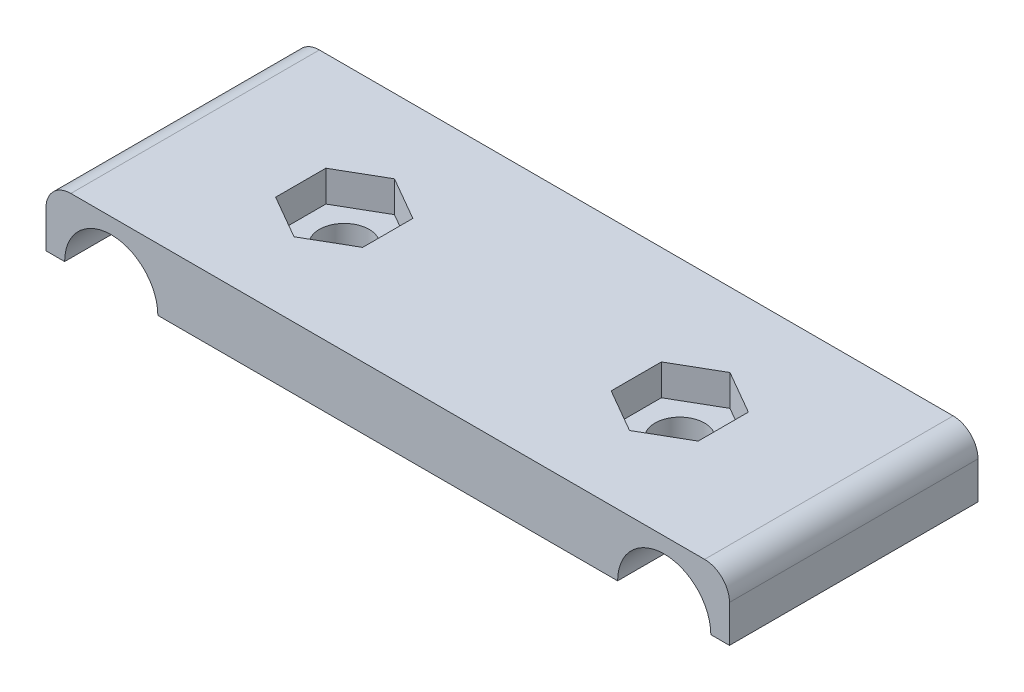
ISO-10303-21;
HEADER;
FILE_DESCRIPTION(('STEP AP214'),'2;1');
FILE_NAME('part.step','',(''),(''),'','','');
FILE_SCHEMA(('AUTOMOTIVE_DESIGN { 1 0 10303 214 1 1 1 1 }'));
ENDSEC;
DATA;
#1=APPLICATION_CONTEXT('core data for automotive mechanical design processes');
#2=APPLICATION_PROTOCOL_DEFINITION('international standard','automotive_design',2000,#1);
#3=PRODUCT_CONTEXT('',#1,'mechanical');
#4=PRODUCT('Part','Part','',(#3));
#5=PRODUCT_RELATED_PRODUCT_CATEGORY('part','',(#4));
#6=PRODUCT_DEFINITION_FORMATION('','',#4);
#7=PRODUCT_DEFINITION_CONTEXT('part definition',#1,'design');
#8=PRODUCT_DEFINITION('design','',#6,#7);
#9=PRODUCT_DEFINITION_SHAPE('','',#8);
#10=(LENGTH_UNIT() NAMED_UNIT(*) SI_UNIT(.MILLI.,.METRE.));
#11=(NAMED_UNIT(*) PLANE_ANGLE_UNIT() SI_UNIT($,.RADIAN.));
#12=(NAMED_UNIT(*) SI_UNIT($,.STERADIAN.) SOLID_ANGLE_UNIT());
#13=UNCERTAINTY_MEASURE_WITH_UNIT(LENGTH_MEASURE(1.E-05),#10,'distance_accuracy_value','');
#14=(GEOMETRIC_REPRESENTATION_CONTEXT(3) GLOBAL_UNCERTAINTY_ASSIGNED_CONTEXT((#13)) GLOBAL_UNIT_ASSIGNED_CONTEXT((#10,
#11,#12)) REPRESENTATION_CONTEXT('',''));
#15=CARTESIAN_POINT('',(0.,0.,0.));
#16=DIRECTION('',(0.,0.,1.));
#17=DIRECTION('',(1.,0.,0.));
#18=AXIS2_PLACEMENT_3D('',#15,#16,#17);
#19=CARTESIAN_POINT('',(-13.5,-2.5,10.));
#20=DIRECTION('',(0.,1.,0.));
#21=DIRECTION('',(0.,0.,1.));
#22=AXIS2_PLACEMENT_3D('',#19,#20,#21);
#23=CYLINDRICAL_SURFACE('',#22,2.);
#24=CARTESIAN_POINT('',(-13.5,-2.5,10.));
#25=DIRECTION('',(0.,1.,0.));
#26=DIRECTION('',(0.,0.,1.));
#27=AXIS2_PLACEMENT_3D('',#24,#25,#26);
#28=CIRCLE('',#27,2.);
#29=CARTESIAN_POINT('',(-13.5,-2.5,12.));
#30=VERTEX_POINT('',#29);
#31=EDGE_CURVE('E286',#30,#30,#28,.T.);
#32=ORIENTED_EDGE('',*,*,#31,.F.);
#33=EDGE_LOOP('',(#32));
#34=FACE_BOUND('',#33,.T.);
#35=CARTESIAN_POINT('',(-13.5,0.,10.));
#36=DIRECTION('',(0.,1.,0.));
#37=DIRECTION('',(0.,0.,1.));
#38=AXIS2_PLACEMENT_3D('',#35,#36,#37);
#39=CIRCLE('',#38,2.);
#40=CARTESIAN_POINT('',(-13.5,0.,12.));
#41=VERTEX_POINT('',#40);
#42=EDGE_CURVE('E37',#41,#41,#39,.F.);
#43=ORIENTED_EDGE('',*,*,#42,.F.);
#44=EDGE_LOOP('',(#43));
#45=FACE_BOUND('',#44,.T.);
#46=ADVANCED_FACE('F33',(#34,#45),#23,.F.);
#47=CARTESIAN_POINT('',(13.5,-2.5,10.));
#48=DIRECTION('',(0.,1.,0.));
#49=DIRECTION('',(0.,0.,1.));
#50=AXIS2_PLACEMENT_3D('',#47,#48,#49);
#51=CYLINDRICAL_SURFACE('',#50,2.);
#52=CARTESIAN_POINT('',(13.5,-2.5,10.));
#53=DIRECTION('',(0.,1.,0.));
#54=DIRECTION('',(0.,0.,1.));
#55=AXIS2_PLACEMENT_3D('',#52,#53,#54);
#56=CIRCLE('',#55,2.);
#57=CARTESIAN_POINT('',(13.5,-2.5,12.));
#58=VERTEX_POINT('',#57);
#59=EDGE_CURVE('E289',#58,#58,#56,.T.);
#60=ORIENTED_EDGE('',*,*,#59,.F.);
#61=EDGE_LOOP('',(#60));
#62=FACE_BOUND('',#61,.T.);
#63=CARTESIAN_POINT('',(13.5,0.,10.));
#64=DIRECTION('',(0.,1.,0.));
#65=DIRECTION('',(0.,0.,1.));
#66=AXIS2_PLACEMENT_3D('',#63,#64,#65);
#67=CIRCLE('',#66,2.);
#68=CARTESIAN_POINT('',(13.5,0.,12.));
#69=VERTEX_POINT('',#68);
#70=EDGE_CURVE('E276',#69,#69,#67,.F.);
#71=ORIENTED_EDGE('',*,*,#70,.F.);
#72=EDGE_LOOP('',(#71));
#73=FACE_BOUND('',#72,.T.);
#74=ADVANCED_FACE('F364',(#62,#73),#51,.F.);
#75=CARTESIAN_POINT('',(-27.5,2.5,20.));
#76=DIRECTION('',(1.,0.,0.));
#77=DIRECTION('',(0.,0.,-1.));
#78=AXIS2_PLACEMENT_3D('',#75,#76,#77);
#79=PLANE('',#78);
#80=DIRECTION('',(0.,-1.,0.));
#81=VECTOR('',#80,1.);
#82=CARTESIAN_POINT('',(-27.5,2.5,20.));
#83=LINE('',#82,#81);
#84=CARTESIAN_POINT('',(-27.5,0.499999999999998,20.));
#85=VERTEX_POINT('',#84);
#86=CARTESIAN_POINT('',(-27.5,-2.5,20.));
#87=VERTEX_POINT('',#86);
#88=EDGE_CURVE('E293',#85,#87,#83,.T.);
#89=ORIENTED_EDGE('',*,*,#88,.F.);
#90=DIRECTION('',(0.,0.,-1.));
#91=VECTOR('',#90,1.);
#92=CARTESIAN_POINT('',(-27.5,0.499999999999998,20.));
#93=LINE('',#92,#91);
#94=CARTESIAN_POINT('',(-27.5,0.499999999999998,0.));
#95=VERTEX_POINT('',#94);
#96=EDGE_CURVE('E11',#85,#95,#93,.T.);
#97=ORIENTED_EDGE('',*,*,#96,.T.);
#98=DIRECTION('',(0.,-1.,0.));
#99=VECTOR('',#98,1.);
#100=CARTESIAN_POINT('',(-27.5,2.5,0.));
#101=LINE('',#100,#99);
#102=CARTESIAN_POINT('',(-27.5,-2.5,0.));
#103=VERTEX_POINT('',#102);
#104=EDGE_CURVE('E292',#95,#103,#101,.T.);
#105=ORIENTED_EDGE('',*,*,#104,.T.);
#106=DIRECTION('',(0.,0.,-1.));
#107=VECTOR('',#106,1.);
#108=CARTESIAN_POINT('',(-27.5,-2.5,20.));
#109=LINE('',#108,#107);
#110=EDGE_CURVE('E343',#87,#103,#109,.T.);
#111=ORIENTED_EDGE('',*,*,#110,.F.);
#112=EDGE_LOOP('',(#89,#97,#105,#111));
#113=FACE_BOUND('',#112,.T.);
#114=ADVANCED_FACE('F366',(#113),#79,.F.);
#115=CARTESIAN_POINT('',(-27.5,-2.5,20.));
#116=DIRECTION('',(0.,1.,0.));
#117=DIRECTION('',(0.,0.,1.));
#118=AXIS2_PLACEMENT_3D('',#115,#116,#117);
#119=PLANE('',#118);
#120=DIRECTION('',(1.,0.,0.));
#121=VECTOR('',#120,1.);
#122=CARTESIAN_POINT('',(-27.5,-2.5,0.));
#123=LINE('',#122,#121);
#124=CARTESIAN_POINT('',(-26.,-2.5,0.));
#125=VERTEX_POINT('',#124);
#126=EDGE_CURVE('E314',#103,#125,#123,.T.);
#127=ORIENTED_EDGE('',*,*,#126,.T.);
#128=DIRECTION('',(0.,0.,-1.));
#129=VECTOR('',#128,1.);
#130=CARTESIAN_POINT('',(-26.,-2.5,20.));
#131=LINE('',#130,#129);
#132=CARTESIAN_POINT('',(-26.,-2.5,20.));
#133=VERTEX_POINT('',#132);
#134=EDGE_CURVE('E340',#133,#125,#131,.T.);
#135=ORIENTED_EDGE('',*,*,#134,.F.);
#136=DIRECTION('',(1.,0.,0.));
#137=VECTOR('',#136,1.);
#138=CARTESIAN_POINT('',(-27.5,-2.5,20.));
#139=LINE('',#138,#137);
#140=EDGE_CURVE('E295',#87,#133,#139,.T.);
#141=ORIENTED_EDGE('',*,*,#140,.F.);
#142=ORIENTED_EDGE('',*,*,#110,.T.);
#143=EDGE_LOOP('',(#127,#135,#141,#142));
#144=FACE_BOUND('',#143,.T.);
#145=ADVANCED_FACE('F373',(#144),#119,.F.);
#146=CARTESIAN_POINT('',(-22.25,-2.5,20.));
#147=DIRECTION('',(0.,0.,-1.));
#148=DIRECTION('',(-1.,0.,0.));
#149=AXIS2_PLACEMENT_3D('',#146,#147,#148);
#150=CYLINDRICAL_SURFACE('',#149,3.75);
#151=CARTESIAN_POINT('',(-22.25,-2.5,0.));
#152=DIRECTION('',(0.,0.,-1.));
#153=DIRECTION('',(1.,0.,0.));
#154=AXIS2_PLACEMENT_3D('',#151,#152,#153);
#155=CIRCLE('',#154,3.75);
#156=CARTESIAN_POINT('',(-18.5,-2.5,0.));
#157=VERTEX_POINT('',#156);
#158=EDGE_CURVE('E316',#125,#157,#155,.T.);
#159=ORIENTED_EDGE('',*,*,#158,.T.);
#160=DIRECTION('',(0.,0.,-1.));
#161=VECTOR('',#160,1.);
#162=CARTESIAN_POINT('',(-18.5,-2.5,20.));
#163=LINE('',#162,#161);
#164=CARTESIAN_POINT('',(-18.5,-2.5,20.));
#165=VERTEX_POINT('',#164);
#166=EDGE_CURVE('E337',#165,#157,#163,.T.);
#167=ORIENTED_EDGE('',*,*,#166,.F.);
#168=CARTESIAN_POINT('',(-22.25,-2.5,20.));
#169=DIRECTION('',(0.,0.,-1.));
#170=DIRECTION('',(1.,0.,0.));
#171=AXIS2_PLACEMENT_3D('',#168,#169,#170);
#172=CIRCLE('',#171,3.75);
#173=EDGE_CURVE('E298',#133,#165,#172,.T.);
#174=ORIENTED_EDGE('',*,*,#173,.F.);
#175=ORIENTED_EDGE('',*,*,#134,.T.);
#176=EDGE_LOOP('',(#159,#167,#174,#175));
#177=FACE_BOUND('',#176,.T.);
#178=ADVANCED_FACE('F409',(#177),#150,.F.);
#179=CARTESIAN_POINT('',(-18.5,-2.5,20.));
#180=DIRECTION('',(0.,1.,0.));
#181=DIRECTION('',(-1.,0.,0.));
#182=AXIS2_PLACEMENT_3D('',#179,#180,#181);
#183=PLANE('',#182);
#184=ORIENTED_EDGE('',*,*,#31,.T.);
#185=EDGE_LOOP('',(#184));
#186=FACE_BOUND('',#185,.T.);
#187=ORIENTED_EDGE('',*,*,#59,.T.);
#188=EDGE_LOOP('',(#187));
#189=FACE_BOUND('',#188,.T.);
#190=DIRECTION('',(1.,0.,0.));
#191=VECTOR('',#190,1.);
#192=CARTESIAN_POINT('',(-18.5,-2.5,0.));
#193=LINE('',#192,#191);
#194=CARTESIAN_POINT('',(18.5,-2.5,0.));
#195=VERTEX_POINT('',#194);
#196=EDGE_CURVE('E318',#157,#195,#193,.T.);
#197=ORIENTED_EDGE('',*,*,#196,.T.);
#198=DIRECTION('',(0.,0.,-1.));
#199=VECTOR('',#198,1.);
#200=CARTESIAN_POINT('',(18.5,-2.5,20.));
#201=LINE('',#200,#199);
#202=CARTESIAN_POINT('',(18.5,-2.5,20.));
#203=VERTEX_POINT('',#202);
#204=EDGE_CURVE('E334',#203,#195,#201,.T.);
#205=ORIENTED_EDGE('',*,*,#204,.F.);
#206=DIRECTION('',(1.,0.,0.));
#207=VECTOR('',#206,1.);
#208=CARTESIAN_POINT('',(-18.5,-2.5,20.));
#209=LINE('',#208,#207);
#210=EDGE_CURVE('E300',#165,#203,#209,.T.);
#211=ORIENTED_EDGE('',*,*,#210,.F.);
#212=ORIENTED_EDGE('',*,*,#166,.T.);
#213=EDGE_LOOP('',(#197,#205,#211,#212));
#214=FACE_BOUND('',#213,.T.);
#215=ADVANCED_FACE('F405',(#186,#189,#214),#183,.F.);
#216=CARTESIAN_POINT('',(22.25,-2.5,20.));
#217=DIRECTION('',(0.,0.,-1.));
#218=DIRECTION('',(-1.,0.,0.));
#219=AXIS2_PLACEMENT_3D('',#216,#217,#218);
#220=CYLINDRICAL_SURFACE('',#219,3.75);
#221=CARTESIAN_POINT('',(22.25,-2.5,0.));
#222=DIRECTION('',(0.,0.,-1.));
#223=DIRECTION('',(1.,0.,0.));
#224=AXIS2_PLACEMENT_3D('',#221,#222,#223);
#225=CIRCLE('',#224,3.75);
#226=CARTESIAN_POINT('',(26.,-2.5,0.));
#227=VERTEX_POINT('',#226);
#228=EDGE_CURVE('E320',#195,#227,#225,.T.);
#229=ORIENTED_EDGE('',*,*,#228,.T.);
#230=DIRECTION('',(0.,0.,-1.));
#231=VECTOR('',#230,1.);
#232=CARTESIAN_POINT('',(26.,-2.5,20.));
#233=LINE('',#232,#231);
#234=CARTESIAN_POINT('',(26.,-2.5,20.));
#235=VERTEX_POINT('',#234);
#236=EDGE_CURVE('E331',#235,#227,#233,.T.);
#237=ORIENTED_EDGE('',*,*,#236,.F.);
#238=CARTESIAN_POINT('',(22.25,-2.5,20.));
#239=DIRECTION('',(0.,0.,-1.));
#240=DIRECTION('',(1.,0.,0.));
#241=AXIS2_PLACEMENT_3D('',#238,#239,#240);
#242=CIRCLE('',#241,3.75);
#243=EDGE_CURVE('E302',#203,#235,#242,.T.);
#244=ORIENTED_EDGE('',*,*,#243,.F.);
#245=ORIENTED_EDGE('',*,*,#204,.T.);
#246=EDGE_LOOP('',(#229,#237,#244,#245));
#247=FACE_BOUND('',#246,.T.);
#248=ADVANCED_FACE('F401',(#247),#220,.F.);
#249=CARTESIAN_POINT('',(26.,-2.5,20.));
#250=DIRECTION('',(0.,1.,0.));
#251=DIRECTION('',(-1.,0.,0.));
#252=AXIS2_PLACEMENT_3D('',#249,#250,#251);
#253=PLANE('',#252);
#254=DIRECTION('',(1.,0.,0.));
#255=VECTOR('',#254,1.);
#256=CARTESIAN_POINT('',(26.,-2.5,0.));
#257=LINE('',#256,#255);
#258=CARTESIAN_POINT('',(27.5,-2.5,0.));
#259=VERTEX_POINT('',#258);
#260=EDGE_CURVE('E322',#227,#259,#257,.T.);
#261=ORIENTED_EDGE('',*,*,#260,.T.);
#262=DIRECTION('',(0.,0.,-1.));
#263=VECTOR('',#262,1.);
#264=CARTESIAN_POINT('',(27.5,-2.5,20.));
#265=LINE('',#264,#263);
#266=CARTESIAN_POINT('',(27.5,-2.5,20.));
#267=VERTEX_POINT('',#266);
#268=EDGE_CURVE('E312',#267,#259,#265,.T.);
#269=ORIENTED_EDGE('',*,*,#268,.F.);
#270=DIRECTION('',(1.,0.,0.));
#271=VECTOR('',#270,1.);
#272=CARTESIAN_POINT('',(26.,-2.5,20.));
#273=LINE('',#272,#271);
#274=EDGE_CURVE('E304',#235,#267,#273,.T.);
#275=ORIENTED_EDGE('',*,*,#274,.F.);
#276=ORIENTED_EDGE('',*,*,#236,.T.);
#277=EDGE_LOOP('',(#261,#269,#275,#276));
#278=FACE_BOUND('',#277,.T.);
#279=ADVANCED_FACE('F397',(#278),#253,.F.);
#280=CARTESIAN_POINT('',(27.5,2.5,20.));
#281=DIRECTION('',(-1.,0.,0.));
#282=DIRECTION('',(0.,0.,1.));
#283=AXIS2_PLACEMENT_3D('',#280,#281,#282);
#284=PLANE('',#283);
#285=DIRECTION('',(0.,1.,0.));
#286=VECTOR('',#285,1.);
#287=CARTESIAN_POINT('',(27.5,2.5,0.));
#288=LINE('',#287,#286);
#289=CARTESIAN_POINT('',(27.5,0.499999999999998,0.));
#290=VERTEX_POINT('',#289);
#291=EDGE_CURVE('E324',#259,#290,#288,.T.);
#292=ORIENTED_EDGE('',*,*,#291,.T.);
#293=DIRECTION('',(0.,0.,-1.));
#294=VECTOR('',#293,1.);
#295=CARTESIAN_POINT('',(27.5,0.499999999999998,20.));
#296=LINE('',#295,#294);
#297=CARTESIAN_POINT('',(27.5,0.499999999999998,20.));
#298=VERTEX_POINT('',#297);
#299=EDGE_CURVE('E355',#290,#298,#296,.F.);
#300=ORIENTED_EDGE('',*,*,#299,.T.);
#301=DIRECTION('',(0.,1.,0.));
#302=VECTOR('',#301,1.);
#303=CARTESIAN_POINT('',(27.5,2.5,20.));
#304=LINE('',#303,#302);
#305=EDGE_CURVE('E306',#267,#298,#304,.T.);
#306=ORIENTED_EDGE('',*,*,#305,.F.);
#307=ORIENTED_EDGE('',*,*,#268,.T.);
#308=EDGE_LOOP('',(#292,#300,#306,#307));
#309=FACE_BOUND('',#308,.T.);
#310=ADVANCED_FACE('F393',(#309),#284,.F.);
#311=CARTESIAN_POINT('',(-27.5,2.5,20.));
#312=DIRECTION('',(0.,-1.,0.));
#313=DIRECTION('',(0.,0.,-1.));
#314=AXIS2_PLACEMENT_3D('',#311,#312,#313);
#315=PLANE('',#314);
#316=DIRECTION('',(-0.866025403784439,0.,0.5));
#317=VECTOR('',#316,1.);
#318=CARTESIAN_POINT('',(-13.5,2.5,5.95854811567262));
#319=LINE('',#318,#317);
#320=CARTESIAN_POINT('',(-13.5,2.5,5.95854811567262));
#321=VERTEX_POINT('',#320);
#322=CARTESIAN_POINT('',(-17.,2.5,7.97927405783631));
#323=VERTEX_POINT('',#322);
#324=EDGE_CURVE('E220',#321,#323,#319,.T.);
#325=ORIENTED_EDGE('',*,*,#324,.F.);
#326=DIRECTION('',(-0.866025403784439,0.,-0.5));
#327=VECTOR('',#326,1.);
#328=CARTESIAN_POINT('',(-10.,2.5,7.97927405783631));
#329=LINE('',#328,#327);
#330=CARTESIAN_POINT('',(-10.,2.5,7.97927405783631));
#331=VERTEX_POINT('',#330);
#332=EDGE_CURVE('E50',#331,#321,#329,.T.);
#333=ORIENTED_EDGE('',*,*,#332,.F.);
#334=DIRECTION('',(0.,0.,-1.));
#335=VECTOR('',#334,1.);
#336=CARTESIAN_POINT('',(-10.,2.5,12.0207259421637));
#337=LINE('',#336,#335);
#338=CARTESIAN_POINT('',(-10.,2.5,12.0207259421637));
#339=VERTEX_POINT('',#338);
#340=EDGE_CURVE('E206',#339,#331,#337,.T.);
#341=ORIENTED_EDGE('',*,*,#340,.F.);
#342=DIRECTION('',(0.866025403784439,0.,-0.5));
#343=VECTOR('',#342,1.);
#344=CARTESIAN_POINT('',(-13.5,2.5,14.0414518843274));
#345=LINE('',#344,#343);
#346=CARTESIAN_POINT('',(-13.5,2.5,14.0414518843274));
#347=VERTEX_POINT('',#346);
#348=EDGE_CURVE('E209',#347,#339,#345,.T.);
#349=ORIENTED_EDGE('',*,*,#348,.F.);
#350=DIRECTION('',(0.866025403784438,0.,0.5));
#351=VECTOR('',#350,1.);
#352=CARTESIAN_POINT('',(-17.,2.5,12.0207259421637));
#353=LINE('',#352,#351);
#354=CARTESIAN_POINT('',(-17.,2.5,12.0207259421637));
#355=VERTEX_POINT('',#354);
#356=EDGE_CURVE('E225',#355,#347,#353,.T.);
#357=ORIENTED_EDGE('',*,*,#356,.F.);
#358=DIRECTION('',(0.,0.,1.));
#359=VECTOR('',#358,1.);
#360=CARTESIAN_POINT('',(-17.,2.5,7.97927405783631));
#361=LINE('',#360,#359);
#362=EDGE_CURVE('E222',#323,#355,#361,.T.);
#363=ORIENTED_EDGE('',*,*,#362,.F.);
#364=EDGE_LOOP('',(#325,#333,#341,#349,#357,#363));
#365=FACE_BOUND('',#364,.T.);
#366=DIRECTION('',(-0.866025403784438,0.,0.5));
#367=VECTOR('',#366,1.);
#368=CARTESIAN_POINT('',(13.5,2.5,5.95854811567262));
#369=LINE('',#368,#367);
#370=CARTESIAN_POINT('',(13.5,2.5,5.95854811567263));
#371=VERTEX_POINT('',#370);
#372=CARTESIAN_POINT('',(10.,2.5,7.97927405783631));
#373=VERTEX_POINT('',#372);
#374=EDGE_CURVE('E260',#371,#373,#369,.T.);
#375=ORIENTED_EDGE('',*,*,#374,.F.);
#376=DIRECTION('',(-0.866025403784439,0.,-0.5));
#377=VECTOR('',#376,1.);
#378=CARTESIAN_POINT('',(17.,2.5,7.97927405783631));
#379=LINE('',#378,#377);
#380=CARTESIAN_POINT('',(17.,2.5,7.97927405783631));
#381=VERTEX_POINT('',#380);
#382=EDGE_CURVE('E58',#381,#371,#379,.T.);
#383=ORIENTED_EDGE('',*,*,#382,.F.);
#384=DIRECTION('',(0.,0.,-1.));
#385=VECTOR('',#384,1.);
#386=CARTESIAN_POINT('',(17.,2.5,12.0207259421637));
#387=LINE('',#386,#385);
#388=CARTESIAN_POINT('',(17.,2.5,12.0207259421637));
#389=VERTEX_POINT('',#388);
#390=EDGE_CURVE('E243',#389,#381,#387,.T.);
#391=ORIENTED_EDGE('',*,*,#390,.F.);
#392=DIRECTION('',(0.866025403784438,0.,-0.5));
#393=VECTOR('',#392,1.);
#394=CARTESIAN_POINT('',(13.5,2.5,14.0414518843274));
#395=LINE('',#394,#393);
#396=CARTESIAN_POINT('',(13.5,2.5,14.0414518843274));
#397=VERTEX_POINT('',#396);
#398=EDGE_CURVE('E269',#397,#389,#395,.T.);
#399=ORIENTED_EDGE('',*,*,#398,.F.);
#400=DIRECTION('',(0.866025403784439,0.,0.5));
#401=VECTOR('',#400,1.);
#402=CARTESIAN_POINT('',(10.,2.5,12.0207259421637));
#403=LINE('',#402,#401);
#404=CARTESIAN_POINT('',(10.,2.5,12.0207259421637));
#405=VERTEX_POINT('',#404);
#406=EDGE_CURVE('E266',#405,#397,#403,.T.);
#407=ORIENTED_EDGE('',*,*,#406,.F.);
#408=DIRECTION('',(0.,0.,1.));
#409=VECTOR('',#408,1.);
#410=CARTESIAN_POINT('',(10.,2.5,7.97927405783631));
#411=LINE('',#410,#409);
#412=EDGE_CURVE('E263',#373,#405,#411,.T.);
#413=ORIENTED_EDGE('',*,*,#412,.F.);
#414=EDGE_LOOP('',(#375,#383,#391,#399,#407,#413));
#415=FACE_BOUND('',#414,.T.);
#416=DIRECTION('',(-1.,0.,0.));
#417=VECTOR('',#416,1.);
#418=CARTESIAN_POINT('',(-27.5,2.5,20.));
#419=LINE('',#418,#417);
#420=CARTESIAN_POINT('',(25.5,2.5,20.));
#421=VERTEX_POINT('',#420);
#422=CARTESIAN_POINT('',(-25.5,2.5,20.));
#423=VERTEX_POINT('',#422);
#424=EDGE_CURVE('E309',#421,#423,#419,.T.);
#425=ORIENTED_EDGE('',*,*,#424,.F.);
#426=DIRECTION('',(0.,0.,-1.));
#427=VECTOR('',#426,1.);
#428=CARTESIAN_POINT('',(25.5,2.5,20.));
#429=LINE('',#428,#427);
#430=CARTESIAN_POINT('',(25.5,2.5,0.));
#431=VERTEX_POINT('',#430);
#432=EDGE_CURVE('E348',#421,#431,#429,.T.);
#433=ORIENTED_EDGE('',*,*,#432,.T.);
#434=DIRECTION('',(-1.,0.,0.));
#435=VECTOR('',#434,1.);
#436=CARTESIAN_POINT('',(-27.5,2.5,0.));
#437=LINE('',#436,#435);
#438=CARTESIAN_POINT('',(-25.5,2.5,0.));
#439=VERTEX_POINT('',#438);
#440=EDGE_CURVE('E296',#431,#439,#437,.T.);
#441=ORIENTED_EDGE('',*,*,#440,.T.);
#442=DIRECTION('',(0.,0.,-1.));
#443=VECTOR('',#442,1.);
#444=CARTESIAN_POINT('',(-25.5,2.5,20.));
#445=LINE('',#444,#443);
#446=EDGE_CURVE('E346',#439,#423,#445,.F.);
#447=ORIENTED_EDGE('',*,*,#446,.T.);
#448=EDGE_LOOP('',(#425,#433,#441,#447));
#449=FACE_BOUND('',#448,.T.);
#450=ADVANCED_FACE('F385',(#365,#415,#449),#315,.F.);
#451=CARTESIAN_POINT('',(-22.25,-2.5,20.));
#452=DIRECTION('',(0.,0.,1.));
#453=DIRECTION('',(1.,0.,0.));
#454=AXIS2_PLACEMENT_3D('',#451,#452,#453);
#455=PLANE('',#454);
#456=ORIENTED_EDGE('',*,*,#305,.T.);
#457=CARTESIAN_POINT('',(25.5,0.499999999999998,20.));
#458=DIRECTION('',(0.,0.,1.));
#459=DIRECTION('',(1.,0.,0.));
#460=AXIS2_PLACEMENT_3D('',#457,#458,#459);
#461=CIRCLE('',#460,2.);
#462=EDGE_CURVE('E42',#298,#421,#461,.T.);
#463=ORIENTED_EDGE('',*,*,#462,.T.);
#464=ORIENTED_EDGE('',*,*,#424,.T.);
#465=CARTESIAN_POINT('',(-25.5,0.499999999999998,20.));
#466=DIRECTION('',(0.,0.,1.));
#467=DIRECTION('',(1.,0.,0.));
#468=AXIS2_PLACEMENT_3D('',#465,#466,#467);
#469=CIRCLE('',#468,2.);
#470=EDGE_CURVE('E357',#423,#85,#469,.T.);
#471=ORIENTED_EDGE('',*,*,#470,.T.);
#472=ORIENTED_EDGE('',*,*,#88,.T.);
#473=ORIENTED_EDGE('',*,*,#140,.T.);
#474=ORIENTED_EDGE('',*,*,#173,.T.);
#475=ORIENTED_EDGE('',*,*,#210,.T.);
#476=ORIENTED_EDGE('',*,*,#243,.T.);
#477=ORIENTED_EDGE('',*,*,#274,.T.);
#478=EDGE_LOOP('',(#456,#463,#464,#471,#472,#473,#474,#475,#476,#477));
#479=FACE_BOUND('',#478,.T.);
#480=ADVANCED_FACE('F381',(#479),#455,.T.);
#481=CARTESIAN_POINT('',(-22.25,-2.5,0.));
#482=DIRECTION('',(0.,0.,1.));
#483=DIRECTION('',(1.,0.,0.));
#484=AXIS2_PLACEMENT_3D('',#481,#482,#483);
#485=PLANE('',#484);
#486=ORIENTED_EDGE('',*,*,#440,.F.);
#487=CARTESIAN_POINT('',(25.5,0.499999999999998,0.));
#488=DIRECTION('',(0.,0.,1.));
#489=DIRECTION('',(1.,0.,0.));
#490=AXIS2_PLACEMENT_3D('',#487,#488,#489);
#491=CIRCLE('',#490,2.);
#492=EDGE_CURVE('E353',#431,#290,#491,.F.);
#493=ORIENTED_EDGE('',*,*,#492,.T.);
#494=ORIENTED_EDGE('',*,*,#291,.F.);
#495=ORIENTED_EDGE('',*,*,#260,.F.);
#496=ORIENTED_EDGE('',*,*,#228,.F.);
#497=ORIENTED_EDGE('',*,*,#196,.F.);
#498=ORIENTED_EDGE('',*,*,#158,.F.);
#499=ORIENTED_EDGE('',*,*,#126,.F.);
#500=ORIENTED_EDGE('',*,*,#104,.F.);
#501=CARTESIAN_POINT('',(-25.5,0.499999999999998,0.));
#502=DIRECTION('',(0.,0.,1.));
#503=DIRECTION('',(1.,0.,0.));
#504=AXIS2_PLACEMENT_3D('',#501,#502,#503);
#505=CIRCLE('',#504,2.);
#506=EDGE_CURVE('E351',#95,#439,#505,.F.);
#507=ORIENTED_EDGE('',*,*,#506,.T.);
#508=EDGE_LOOP('',(#486,#493,#494,#495,#496,#497,#498,#499,#500,#507));
#509=FACE_BOUND('',#508,.T.);
#510=ADVANCED_FACE('F384',(#509),#485,.F.);
#511=CARTESIAN_POINT('',(25.5,0.499999999999998,20.));
#512=DIRECTION('',(0.,0.,-1.));
#513=DIRECTION('',(-1.,0.,0.));
#514=AXIS2_PLACEMENT_3D('',#511,#512,#513);
#515=CYLINDRICAL_SURFACE('',#514,2.);
#516=ORIENTED_EDGE('',*,*,#462,.F.);
#517=ORIENTED_EDGE('',*,*,#299,.F.);
#518=ORIENTED_EDGE('',*,*,#492,.F.);
#519=ORIENTED_EDGE('',*,*,#432,.F.);
#520=EDGE_LOOP('',(#516,#517,#518,#519));
#521=FACE_BOUND('',#520,.T.);
#522=ADVANCED_FACE('F389',(#521),#515,.T.);
#523=CARTESIAN_POINT('',(-25.5,0.499999999999998,20.));
#524=DIRECTION('',(0.,0.,-1.));
#525=DIRECTION('',(-1.,0.,0.));
#526=AXIS2_PLACEMENT_3D('',#523,#524,#525);
#527=CYLINDRICAL_SURFACE('',#526,2.);
#528=ORIENTED_EDGE('',*,*,#470,.F.);
#529=ORIENTED_EDGE('',*,*,#446,.F.);
#530=ORIENTED_EDGE('',*,*,#506,.F.);
#531=ORIENTED_EDGE('',*,*,#96,.F.);
#532=EDGE_LOOP('',(#528,#529,#530,#531));
#533=FACE_BOUND('',#532,.T.);
#534=ADVANCED_FACE('F35',(#533),#527,.T.);
#535=CARTESIAN_POINT('',(0.,0.,0.));
#536=DIRECTION('',(0.,1.,0.));
#537=DIRECTION('',(0.,0.,1.));
#538=AXIS2_PLACEMENT_3D('',#535,#536,#537);
#539=PLANE('',#538);
#540=DIRECTION('',(-0.866025403784439,0.,-0.5));
#541=VECTOR('',#540,1.);
#542=CARTESIAN_POINT('',(17.,0.,7.97927405783631));
#543=LINE('',#542,#541);
#544=CARTESIAN_POINT('',(17.,0.,7.97927405783631));
#545=VERTEX_POINT('',#544);
#546=CARTESIAN_POINT('',(13.5,0.,5.95854811567262));
#547=VERTEX_POINT('',#546);
#548=EDGE_CURVE('E239',#545,#547,#543,.T.);
#549=ORIENTED_EDGE('',*,*,#548,.T.);
#550=DIRECTION('',(-0.866025403784438,0.,0.5));
#551=VECTOR('',#550,1.);
#552=CARTESIAN_POINT('',(13.5,0.,5.95854811567262));
#553=LINE('',#552,#551);
#554=CARTESIAN_POINT('',(10.,0.,7.97927405783631));
#555=VERTEX_POINT('',#554);
#556=EDGE_CURVE('E242',#547,#555,#553,.T.);
#557=ORIENTED_EDGE('',*,*,#556,.T.);
#558=DIRECTION('',(0.,0.,1.));
#559=VECTOR('',#558,1.);
#560=CARTESIAN_POINT('',(10.,0.,7.97927405783631));
#561=LINE('',#560,#559);
#562=CARTESIAN_POINT('',(10.,0.,12.0207259421637));
#563=VERTEX_POINT('',#562);
#564=EDGE_CURVE('E246',#555,#563,#561,.T.);
#565=ORIENTED_EDGE('',*,*,#564,.T.);
#566=DIRECTION('',(0.866025403784439,0.,0.5));
#567=VECTOR('',#566,1.);
#568=CARTESIAN_POINT('',(10.,0.,12.0207259421637));
#569=LINE('',#568,#567);
#570=CARTESIAN_POINT('',(13.5,0.,14.0414518843274));
#571=VERTEX_POINT('',#570);
#572=EDGE_CURVE('E249',#563,#571,#569,.T.);
#573=ORIENTED_EDGE('',*,*,#572,.T.);
#574=DIRECTION('',(0.866025403784438,0.,-0.5));
#575=VECTOR('',#574,1.);
#576=CARTESIAN_POINT('',(13.5,0.,14.0414518843274));
#577=LINE('',#576,#575);
#578=CARTESIAN_POINT('',(17.,0.,12.0207259421637));
#579=VERTEX_POINT('',#578);
#580=EDGE_CURVE('E252',#571,#579,#577,.T.);
#581=ORIENTED_EDGE('',*,*,#580,.T.);
#582=DIRECTION('',(0.,0.,-1.));
#583=VECTOR('',#582,1.);
#584=CARTESIAN_POINT('',(17.,0.,12.0207259421637));
#585=LINE('',#584,#583);
#586=EDGE_CURVE('E255',#579,#545,#585,.T.);
#587=ORIENTED_EDGE('',*,*,#586,.T.);
#588=EDGE_LOOP('',(#549,#557,#565,#573,#581,#587));
#589=FACE_BOUND('',#588,.T.);
#590=ORIENTED_EDGE('',*,*,#70,.T.);
#591=EDGE_LOOP('',(#590));
#592=FACE_BOUND('',#591,.T.);
#593=ADVANCED_FACE('F362',(#589,#592),#539,.T.);
#594=CARTESIAN_POINT('',(17.,0.,7.97927405783631));
#595=DIRECTION('',(0.5,0.,-0.866025403784439));
#596=DIRECTION('',(-0.866025403784439,0.,-0.5));
#597=AXIS2_PLACEMENT_3D('',#594,#595,#596);
#598=PLANE('',#597);
#599=ORIENTED_EDGE('',*,*,#382,.T.);
#600=DIRECTION('',(0.,1.,0.));
#601=VECTOR('',#600,1.);
#602=CARTESIAN_POINT('',(13.5,0.,5.95854811567262));
#603=LINE('',#602,#601);
#604=EDGE_CURVE('E258',#547,#371,#603,.T.);
#605=ORIENTED_EDGE('',*,*,#604,.F.);
#606=ORIENTED_EDGE('',*,*,#548,.F.);
#607=DIRECTION('',(0.,1.,0.));
#608=VECTOR('',#607,1.);
#609=CARTESIAN_POINT('',(17.,0.,7.97927405783631));
#610=LINE('',#609,#608);
#611=EDGE_CURVE('E274',#545,#381,#610,.T.);
#612=ORIENTED_EDGE('',*,*,#611,.T.);
#613=EDGE_LOOP('',(#599,#605,#606,#612));
#614=FACE_BOUND('',#613,.T.);
#615=ADVANCED_FACE('F455',(#614),#598,.F.);
#616=CARTESIAN_POINT('',(17.,0.,12.0207259421637));
#617=DIRECTION('',(1.,0.,0.));
#618=DIRECTION('',(0.,0.,-1.));
#619=AXIS2_PLACEMENT_3D('',#616,#617,#618);
#620=PLANE('',#619);
#621=ORIENTED_EDGE('',*,*,#390,.T.);
#622=ORIENTED_EDGE('',*,*,#611,.F.);
#623=ORIENTED_EDGE('',*,*,#586,.F.);
#624=DIRECTION('',(0.,1.,0.));
#625=VECTOR('',#624,1.);
#626=CARTESIAN_POINT('',(17.,0.,12.0207259421637));
#627=LINE('',#626,#625);
#628=EDGE_CURVE('E277',#579,#389,#627,.T.);
#629=ORIENTED_EDGE('',*,*,#628,.T.);
#630=EDGE_LOOP('',(#621,#622,#623,#629));
#631=FACE_BOUND('',#630,.T.);
#632=ADVANCED_FACE('F461',(#631),#620,.F.);
#633=CARTESIAN_POINT('',(13.5,0.,14.0414518843274));
#634=DIRECTION('',(0.5,0.,0.866025403784438));
#635=DIRECTION('',(0.866025403784439,0.,-0.5));
#636=AXIS2_PLACEMENT_3D('',#633,#634,#635);
#637=PLANE('',#636);
#638=ORIENTED_EDGE('',*,*,#398,.T.);
#639=ORIENTED_EDGE('',*,*,#628,.F.);
#640=ORIENTED_EDGE('',*,*,#580,.F.);
#641=DIRECTION('',(0.,1.,0.));
#642=VECTOR('',#641,1.);
#643=CARTESIAN_POINT('',(13.5,0.,14.0414518843274));
#644=LINE('',#643,#642);
#645=EDGE_CURVE('E279',#571,#397,#644,.T.);
#646=ORIENTED_EDGE('',*,*,#645,.T.);
#647=EDGE_LOOP('',(#638,#639,#640,#646));
#648=FACE_BOUND('',#647,.T.);
#649=ADVANCED_FACE('F467',(#648),#637,.F.);
#650=CARTESIAN_POINT('',(10.,0.,12.0207259421637));
#651=DIRECTION('',(-0.5,0.,0.866025403784438));
#652=DIRECTION('',(0.866025403784439,0.,0.5));
#653=AXIS2_PLACEMENT_3D('',#650,#651,#652);
#654=PLANE('',#653);
#655=ORIENTED_EDGE('',*,*,#406,.T.);
#656=ORIENTED_EDGE('',*,*,#645,.F.);
#657=ORIENTED_EDGE('',*,*,#572,.F.);
#658=DIRECTION('',(0.,1.,0.));
#659=VECTOR('',#658,1.);
#660=CARTESIAN_POINT('',(10.,0.,12.0207259421637));
#661=LINE('',#660,#659);
#662=EDGE_CURVE('E281',#563,#405,#661,.T.);
#663=ORIENTED_EDGE('',*,*,#662,.T.);
#664=EDGE_LOOP('',(#655,#656,#657,#663));
#665=FACE_BOUND('',#664,.T.);
#666=ADVANCED_FACE('F471',(#665),#654,.F.);
#667=CARTESIAN_POINT('',(10.,0.,7.97927405783631));
#668=DIRECTION('',(-1.,0.,0.));
#669=DIRECTION('',(0.,0.,1.));
#670=AXIS2_PLACEMENT_3D('',#667,#668,#669);
#671=PLANE('',#670);
#672=ORIENTED_EDGE('',*,*,#412,.T.);
#673=ORIENTED_EDGE('',*,*,#662,.F.);
#674=ORIENTED_EDGE('',*,*,#564,.F.);
#675=DIRECTION('',(0.,1.,0.));
#676=VECTOR('',#675,1.);
#677=CARTESIAN_POINT('',(10.,0.,7.97927405783631));
#678=LINE('',#677,#676);
#679=EDGE_CURVE('E283',#555,#373,#678,.T.);
#680=ORIENTED_EDGE('',*,*,#679,.T.);
#681=EDGE_LOOP('',(#672,#673,#674,#680));
#682=FACE_BOUND('',#681,.T.);
#683=ADVANCED_FACE('F475',(#682),#671,.F.);
#684=CARTESIAN_POINT('',(13.5,0.,5.95854811567262));
#685=DIRECTION('',(-0.5,0.,-0.866025403784438));
#686=DIRECTION('',(-0.866025403784438,0.,0.5));
#687=AXIS2_PLACEMENT_3D('',#684,#685,#686);
#688=PLANE('',#687);
#689=ORIENTED_EDGE('',*,*,#374,.T.);
#690=ORIENTED_EDGE('',*,*,#679,.F.);
#691=ORIENTED_EDGE('',*,*,#556,.F.);
#692=ORIENTED_EDGE('',*,*,#604,.T.);
#693=EDGE_LOOP('',(#689,#690,#691,#692));
#694=FACE_BOUND('',#693,.T.);
#695=ADVANCED_FACE('F479',(#694),#688,.F.);
#696=CARTESIAN_POINT('',(0.,0.,0.));
#697=DIRECTION('',(0.,1.,0.));
#698=DIRECTION('',(0.,0.,1.));
#699=AXIS2_PLACEMENT_3D('',#696,#697,#698);
#700=PLANE('',#699);
#701=DIRECTION('',(-0.866025403784439,0.,-0.5));
#702=VECTOR('',#701,1.);
#703=CARTESIAN_POINT('',(-10.,0.,7.97927405783631));
#704=LINE('',#703,#702);
#705=CARTESIAN_POINT('',(-10.,0.,7.97927405783631));
#706=VERTEX_POINT('',#705);
#707=CARTESIAN_POINT('',(-13.5,0.,5.95854811567262));
#708=VERTEX_POINT('',#707);
#709=EDGE_CURVE('E186',#706,#708,#704,.T.);
#710=ORIENTED_EDGE('',*,*,#709,.T.);
#711=DIRECTION('',(-0.866025403784439,0.,0.5));
#712=VECTOR('',#711,1.);
#713=CARTESIAN_POINT('',(-13.5,0.,5.95854811567262));
#714=LINE('',#713,#712);
#715=CARTESIAN_POINT('',(-17.,0.,7.97927405783631));
#716=VERTEX_POINT('',#715);
#717=EDGE_CURVE('E195',#708,#716,#714,.T.);
#718=ORIENTED_EDGE('',*,*,#717,.T.);
#719=DIRECTION('',(0.,0.,1.));
#720=VECTOR('',#719,1.);
#721=CARTESIAN_POINT('',(-17.,0.,7.97927405783631));
#722=LINE('',#721,#720);
#723=CARTESIAN_POINT('',(-17.,0.,12.0207259421637));
#724=VERTEX_POINT('',#723);
#725=EDGE_CURVE('E200',#716,#724,#722,.T.);
#726=ORIENTED_EDGE('',*,*,#725,.T.);
#727=DIRECTION('',(0.866025403784438,0.,0.5));
#728=VECTOR('',#727,1.);
#729=CARTESIAN_POINT('',(-17.,0.,12.0207259421637));
#730=LINE('',#729,#728);
#731=CARTESIAN_POINT('',(-13.5,0.,14.0414518843274));
#732=VERTEX_POINT('',#731);
#733=EDGE_CURVE('E213',#724,#732,#730,.T.);
#734=ORIENTED_EDGE('',*,*,#733,.T.);
#735=DIRECTION('',(0.866025403784439,0.,-0.5));
#736=VECTOR('',#735,1.);
#737=CARTESIAN_POINT('',(-13.5,0.,14.0414518843274));
#738=LINE('',#737,#736);
#739=CARTESIAN_POINT('',(-10.,0.,12.0207259421637));
#740=VERTEX_POINT('',#739);
#741=EDGE_CURVE('E216',#732,#740,#738,.T.);
#742=ORIENTED_EDGE('',*,*,#741,.T.);
#743=DIRECTION('',(0.,0.,-1.));
#744=VECTOR('',#743,1.);
#745=CARTESIAN_POINT('',(-10.,0.,12.0207259421637));
#746=LINE('',#745,#744);
#747=EDGE_CURVE('E192',#740,#706,#746,.T.);
#748=ORIENTED_EDGE('',*,*,#747,.T.);
#749=EDGE_LOOP('',(#710,#718,#726,#734,#742,#748));
#750=FACE_BOUND('',#749,.T.);
#751=ORIENTED_EDGE('',*,*,#42,.T.);
#752=EDGE_LOOP('',(#751));
#753=FACE_BOUND('',#752,.T.);
#754=ADVANCED_FACE('F202',(#750,#753),#700,.T.);
#755=CARTESIAN_POINT('',(-10.,0.,7.97927405783631));
#756=DIRECTION('',(0.5,0.,-0.866025403784438));
#757=DIRECTION('',(-0.866025403784439,0.,-0.5));
#758=AXIS2_PLACEMENT_3D('',#755,#756,#757);
#759=PLANE('',#758);
#760=ORIENTED_EDGE('',*,*,#332,.T.);
#761=DIRECTION('',(0.,1.,0.));
#762=VECTOR('',#761,1.);
#763=CARTESIAN_POINT('',(-13.5,0.,5.95854811567262));
#764=LINE('',#763,#762);
#765=EDGE_CURVE('E182',#708,#321,#764,.T.);
#766=ORIENTED_EDGE('',*,*,#765,.F.);
#767=ORIENTED_EDGE('',*,*,#709,.F.);
#768=DIRECTION('',(0.,1.,0.));
#769=VECTOR('',#768,1.);
#770=CARTESIAN_POINT('',(-10.,0.,7.97927405783631));
#771=LINE('',#770,#769);
#772=EDGE_CURVE('E230',#706,#331,#771,.T.);
#773=ORIENTED_EDGE('',*,*,#772,.T.);
#774=EDGE_LOOP('',(#760,#766,#767,#773));
#775=FACE_BOUND('',#774,.T.);
#776=ADVANCED_FACE('F184',(#775),#759,.F.);
#777=CARTESIAN_POINT('',(-10.,0.,12.0207259421637));
#778=DIRECTION('',(1.,0.,0.));
#779=DIRECTION('',(0.,0.,-1.));
#780=AXIS2_PLACEMENT_3D('',#777,#778,#779);
#781=PLANE('',#780);
#782=ORIENTED_EDGE('',*,*,#340,.T.);
#783=ORIENTED_EDGE('',*,*,#772,.F.);
#784=ORIENTED_EDGE('',*,*,#747,.F.);
#785=DIRECTION('',(0.,1.,0.));
#786=VECTOR('',#785,1.);
#787=CARTESIAN_POINT('',(-10.,0.,12.0207259421637));
#788=LINE('',#787,#786);
#789=EDGE_CURVE('E232',#740,#339,#788,.T.);
#790=ORIENTED_EDGE('',*,*,#789,.T.);
#791=EDGE_LOOP('',(#782,#783,#784,#790));
#792=FACE_BOUND('',#791,.T.);
#793=ADVANCED_FACE('F502',(#792),#781,.F.);
#794=CARTESIAN_POINT('',(-13.5,0.,14.0414518843274));
#795=DIRECTION('',(0.5,0.,0.866025403784439));
#796=DIRECTION('',(0.866025403784439,0.,-0.5));
#797=AXIS2_PLACEMENT_3D('',#794,#795,#796);
#798=PLANE('',#797);
#799=ORIENTED_EDGE('',*,*,#348,.T.);
#800=ORIENTED_EDGE('',*,*,#789,.F.);
#801=ORIENTED_EDGE('',*,*,#741,.F.);
#802=DIRECTION('',(0.,1.,0.));
#803=VECTOR('',#802,1.);
#804=CARTESIAN_POINT('',(-13.5,0.,14.0414518843274));
#805=LINE('',#804,#803);
#806=EDGE_CURVE('E234',#732,#347,#805,.T.);
#807=ORIENTED_EDGE('',*,*,#806,.T.);
#808=EDGE_LOOP('',(#799,#800,#801,#807));
#809=FACE_BOUND('',#808,.T.);
#810=ADVANCED_FACE('F506',(#809),#798,.F.);
#811=CARTESIAN_POINT('',(-17.,0.,12.0207259421637));
#812=DIRECTION('',(-0.5,0.,0.866025403784438));
#813=DIRECTION('',(0.866025403784438,0.,0.5));
#814=AXIS2_PLACEMENT_3D('',#811,#812,#813);
#815=PLANE('',#814);
#816=ORIENTED_EDGE('',*,*,#356,.T.);
#817=ORIENTED_EDGE('',*,*,#806,.F.);
#818=ORIENTED_EDGE('',*,*,#733,.F.);
#819=DIRECTION('',(0.,1.,0.));
#820=VECTOR('',#819,1.);
#821=CARTESIAN_POINT('',(-17.,0.,12.0207259421637));
#822=LINE('',#821,#820);
#823=EDGE_CURVE('E236',#724,#355,#822,.T.);
#824=ORIENTED_EDGE('',*,*,#823,.T.);
#825=EDGE_LOOP('',(#816,#817,#818,#824));
#826=FACE_BOUND('',#825,.T.);
#827=ADVANCED_FACE('F510',(#826),#815,.F.);
#828=CARTESIAN_POINT('',(-17.,0.,7.97927405783631));
#829=DIRECTION('',(-1.,0.,0.));
#830=DIRECTION('',(0.,0.,1.));
#831=AXIS2_PLACEMENT_3D('',#828,#829,#830);
#832=PLANE('',#831);
#833=ORIENTED_EDGE('',*,*,#362,.T.);
#834=ORIENTED_EDGE('',*,*,#823,.F.);
#835=ORIENTED_EDGE('',*,*,#725,.F.);
#836=DIRECTION('',(0.,1.,0.));
#837=VECTOR('',#836,1.);
#838=CARTESIAN_POINT('',(-17.,0.,7.97927405783631));
#839=LINE('',#838,#837);
#840=EDGE_CURVE('E191',#716,#323,#839,.T.);
#841=ORIENTED_EDGE('',*,*,#840,.T.);
#842=EDGE_LOOP('',(#833,#834,#835,#841));
#843=FACE_BOUND('',#842,.T.);
#844=ADVANCED_FACE('F514',(#843),#832,.F.);
#845=CARTESIAN_POINT('',(-13.5,0.,5.95854811567262));
#846=DIRECTION('',(-0.5,0.,-0.866025403784438));
#847=DIRECTION('',(-0.866025403784439,0.,0.5));
#848=AXIS2_PLACEMENT_3D('',#845,#846,#847);
#849=PLANE('',#848);
#850=ORIENTED_EDGE('',*,*,#324,.T.);
#851=ORIENTED_EDGE('',*,*,#840,.F.);
#852=ORIENTED_EDGE('',*,*,#717,.F.);
#853=ORIENTED_EDGE('',*,*,#765,.T.);
#854=EDGE_LOOP('',(#850,#851,#852,#853));
#855=FACE_BOUND('',#854,.T.);
#856=ADVANCED_FACE('F196',(#855),#849,.F.);
#857=CLOSED_SHELL('',(#46,#74,#114,#145,#178,#215,#248,#279,#310,#450,#480,#510,#522,#534,#593,
#615,#632,#649,#666,#683,#695,#754,#776,#793,#810,#827,#844,#856));
#858=MANIFOLD_SOLID_BREP('B2',#857);
#859=ADVANCED_BREP_SHAPE_REPRESENTATION('',(#18,#858),#14);
#860=SHAPE_DEFINITION_REPRESENTATION(#9,#859);
ENDSEC;
END-ISO-10303-21;
